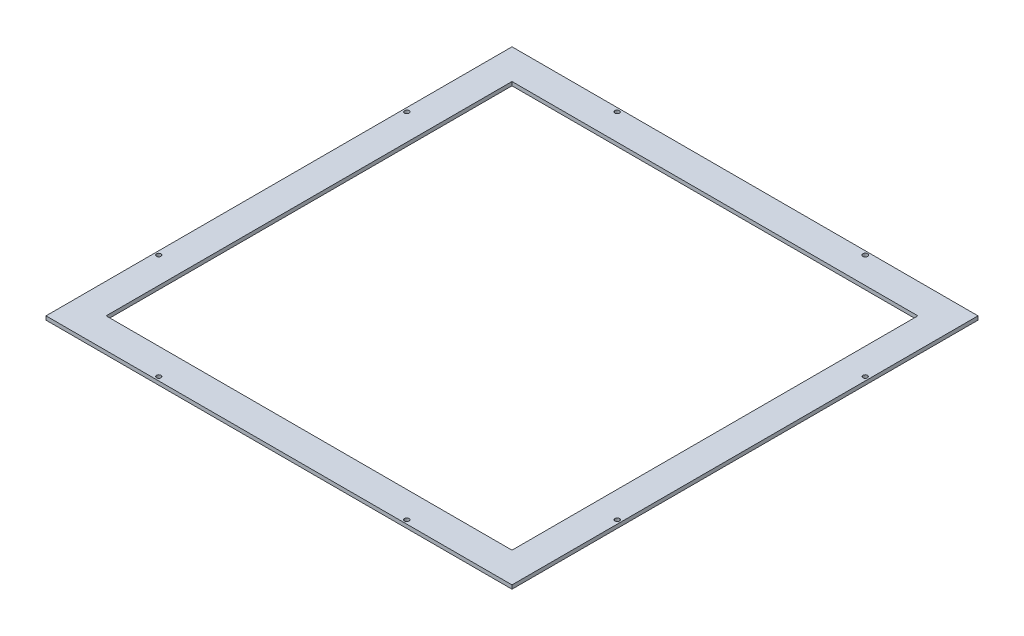
ISO-10303-21;
HEADER;
FILE_DESCRIPTION(('STEP AP214'),'2;1');
FILE_NAME('part.step','',(''),(''),'','','');
FILE_SCHEMA(('AUTOMOTIVE_DESIGN { 1 0 10303 214 1 1 1 1 }'));
ENDSEC;
DATA;
#1=APPLICATION_CONTEXT('core data for automotive mechanical design processes');
#2=APPLICATION_PROTOCOL_DEFINITION('international standard','automotive_design',2000,#1);
#3=PRODUCT_CONTEXT('',#1,'mechanical');
#4=PRODUCT('Part','Part','',(#3));
#5=PRODUCT_RELATED_PRODUCT_CATEGORY('part','',(#4));
#6=PRODUCT_DEFINITION_FORMATION('','',#4);
#7=PRODUCT_DEFINITION_CONTEXT('part definition',#1,'design');
#8=PRODUCT_DEFINITION('design','',#6,#7);
#9=PRODUCT_DEFINITION_SHAPE('','',#8);
#10=(LENGTH_UNIT() NAMED_UNIT(*) SI_UNIT(.MILLI.,.METRE.));
#11=(NAMED_UNIT(*) PLANE_ANGLE_UNIT() SI_UNIT($,.RADIAN.));
#12=(NAMED_UNIT(*) SI_UNIT($,.STERADIAN.) SOLID_ANGLE_UNIT());
#13=UNCERTAINTY_MEASURE_WITH_UNIT(LENGTH_MEASURE(1.E-05),#10,'distance_accuracy_value','');
#14=(GEOMETRIC_REPRESENTATION_CONTEXT(3) GLOBAL_UNCERTAINTY_ASSIGNED_CONTEXT((#13)) GLOBAL_UNIT_ASSIGNED_CONTEXT((#10,
#11,#12)) REPRESENTATION_CONTEXT('',''));
#15=CARTESIAN_POINT('',(0.,0.,0.));
#16=DIRECTION('',(0.,0.,1.));
#17=DIRECTION('',(1.,0.,0.));
#18=AXIS2_PLACEMENT_3D('',#15,#16,#17);
#19=CARTESIAN_POINT('',(-196.85,3.175,-196.85));
#20=DIRECTION('',(1.,0.,0.));
#21=DIRECTION('',(0.,0.,-1.));
#22=AXIS2_PLACEMENT_3D('',#19,#20,#21);
#23=PLANE('',#22);
#24=DIRECTION('',(0.,0.,1.));
#25=VECTOR('',#24,1.);
#26=CARTESIAN_POINT('',(-196.85,0.,-196.85));
#27=LINE('',#26,#25);
#28=CARTESIAN_POINT('',(-196.85,0.,-196.85));
#29=VERTEX_POINT('',#28);
#30=CARTESIAN_POINT('',(-196.85,0.,196.85));
#31=VERTEX_POINT('',#30);
#32=EDGE_CURVE('E134',#29,#31,#27,.T.);
#33=ORIENTED_EDGE('',*,*,#32,.T.);
#34=DIRECTION('',(0.,-1.,0.));
#35=VECTOR('',#34,1.);
#36=CARTESIAN_POINT('',(-196.85,3.175,196.85));
#37=LINE('',#36,#35);
#38=CARTESIAN_POINT('',(-196.85,3.175,196.85));
#39=VERTEX_POINT('',#38);
#40=EDGE_CURVE('E11',#39,#31,#37,.T.);
#41=ORIENTED_EDGE('',*,*,#40,.F.);
#42=DIRECTION('',(0.,0.,1.));
#43=VECTOR('',#42,1.);
#44=CARTESIAN_POINT('',(-196.85,3.175,-196.85));
#45=LINE('',#44,#43);
#46=CARTESIAN_POINT('',(-196.85,3.175,-196.85));
#47=VERTEX_POINT('',#46);
#48=EDGE_CURVE('E138',#47,#39,#45,.T.);
#49=ORIENTED_EDGE('',*,*,#48,.F.);
#50=DIRECTION('',(0.,-1.,0.));
#51=VECTOR('',#50,1.);
#52=CARTESIAN_POINT('',(-196.85,3.175,-196.85));
#53=LINE('',#52,#51);
#54=EDGE_CURVE('E148',#47,#29,#53,.T.);
#55=ORIENTED_EDGE('',*,*,#54,.T.);
#56=EDGE_LOOP('',(#33,#41,#49,#55));
#57=FACE_BOUND('',#56,.T.);
#58=ADVANCED_FACE('F33',(#57),#23,.F.);
#59=CARTESIAN_POINT('',(196.85,3.175,196.85));
#60=DIRECTION('',(0.,0.,-1.));
#61=DIRECTION('',(-1.,0.,0.));
#62=AXIS2_PLACEMENT_3D('',#59,#60,#61);
#63=PLANE('',#62);
#64=DIRECTION('',(1.,0.,0.));
#65=VECTOR('',#64,1.);
#66=CARTESIAN_POINT('',(196.85,0.,196.85));
#67=LINE('',#66,#65);
#68=CARTESIAN_POINT('',(196.85,0.,196.85));
#69=VERTEX_POINT('',#68);
#70=EDGE_CURVE('E151',#31,#69,#67,.T.);
#71=ORIENTED_EDGE('',*,*,#70,.T.);
#72=DIRECTION('',(0.,-1.,0.));
#73=VECTOR('',#72,1.);
#74=CARTESIAN_POINT('',(196.85,3.175,196.85));
#75=LINE('',#74,#73);
#76=CARTESIAN_POINT('',(196.85,3.175,196.85));
#77=VERTEX_POINT('',#76);
#78=EDGE_CURVE('E40',#77,#69,#75,.T.);
#79=ORIENTED_EDGE('',*,*,#78,.F.);
#80=DIRECTION('',(1.,0.,0.));
#81=VECTOR('',#80,1.);
#82=CARTESIAN_POINT('',(196.85,3.175,196.85));
#83=LINE('',#82,#81);
#84=EDGE_CURVE('E141',#39,#77,#83,.T.);
#85=ORIENTED_EDGE('',*,*,#84,.F.);
#86=ORIENTED_EDGE('',*,*,#40,.T.);
#87=EDGE_LOOP('',(#71,#79,#85,#86));
#88=FACE_BOUND('',#87,.T.);
#89=ADVANCED_FACE('F179',(#88),#63,.F.);
#90=CARTESIAN_POINT('',(196.85,3.175,-196.85));
#91=DIRECTION('',(-1.,0.,0.));
#92=DIRECTION('',(0.,0.,1.));
#93=AXIS2_PLACEMENT_3D('',#90,#91,#92);
#94=PLANE('',#93);
#95=DIRECTION('',(0.,0.,-1.));
#96=VECTOR('',#95,1.);
#97=CARTESIAN_POINT('',(196.85,0.,-196.85));
#98=LINE('',#97,#96);
#99=CARTESIAN_POINT('',(196.85,0.,-196.85));
#100=VERTEX_POINT('',#99);
#101=EDGE_CURVE('E153',#69,#100,#98,.T.);
#102=ORIENTED_EDGE('',*,*,#101,.T.);
#103=DIRECTION('',(0.,-1.,0.));
#104=VECTOR('',#103,1.);
#105=CARTESIAN_POINT('',(196.85,3.175,-196.85));
#106=LINE('',#105,#104);
#107=CARTESIAN_POINT('',(196.85,3.175,-196.85));
#108=VERTEX_POINT('',#107);
#109=EDGE_CURVE('E158',#108,#100,#106,.T.);
#110=ORIENTED_EDGE('',*,*,#109,.F.);
#111=DIRECTION('',(0.,0.,-1.));
#112=VECTOR('',#111,1.);
#113=CARTESIAN_POINT('',(196.85,3.175,-196.85));
#114=LINE('',#113,#112);
#115=EDGE_CURVE('E144',#77,#108,#114,.T.);
#116=ORIENTED_EDGE('',*,*,#115,.F.);
#117=ORIENTED_EDGE('',*,*,#78,.T.);
#118=EDGE_LOOP('',(#102,#110,#116,#117));
#119=FACE_BOUND('',#118,.T.);
#120=ADVANCED_FACE('F165',(#119),#94,.F.);
#121=CARTESIAN_POINT('',(196.85,3.175,-196.85));
#122=DIRECTION('',(0.,0.,1.));
#123=DIRECTION('',(1.,0.,0.));
#124=AXIS2_PLACEMENT_3D('',#121,#122,#123);
#125=PLANE('',#124);
#126=DIRECTION('',(-1.,0.,0.));
#127=VECTOR('',#126,1.);
#128=CARTESIAN_POINT('',(196.85,0.,-196.85));
#129=LINE('',#128,#127);
#130=EDGE_CURVE('E142',#100,#29,#129,.T.);
#131=ORIENTED_EDGE('',*,*,#130,.T.);
#132=ORIENTED_EDGE('',*,*,#54,.F.);
#133=DIRECTION('',(-1.,0.,0.));
#134=VECTOR('',#133,1.);
#135=CARTESIAN_POINT('',(196.85,3.175,-196.85));
#136=LINE('',#135,#134);
#137=EDGE_CURVE('E146',#108,#47,#136,.T.);
#138=ORIENTED_EDGE('',*,*,#137,.F.);
#139=ORIENTED_EDGE('',*,*,#109,.T.);
#140=EDGE_LOOP('',(#131,#132,#138,#139));
#141=FACE_BOUND('',#140,.T.);
#142=ADVANCED_FACE('F172',(#141),#125,.F.);
#143=CARTESIAN_POINT('',(0.,3.175,0.));
#144=DIRECTION('',(0.,-1.,0.));
#145=DIRECTION('',(0.,0.,-1.));
#146=AXIS2_PLACEMENT_3D('',#143,#144,#145);
#147=PLANE('',#146);
#148=CARTESIAN_POINT('',(104.775,3.175,193.675));
#149=DIRECTION('',(0.,1.,0.));
#150=DIRECTION('',(0.,0.,1.));
#151=AXIS2_PLACEMENT_3D('',#148,#149,#150);
#152=CIRCLE('',#151,1.905);
#153=CARTESIAN_POINT('',(104.775,3.175,195.58));
#154=VERTEX_POINT('',#153);
#155=EDGE_CURVE('E266',#154,#154,#152,.T.);
#156=ORIENTED_EDGE('',*,*,#155,.F.);
#157=EDGE_LOOP('',(#156));
#158=FACE_BOUND('',#157,.T.);
#159=CARTESIAN_POINT('',(-193.675,3.175,104.775));
#160=DIRECTION('',(0.,1.,0.));
#161=DIRECTION('',(0.,0.,1.));
#162=AXIS2_PLACEMENT_3D('',#159,#160,#161);
#163=CIRCLE('',#162,1.90499999999999);
#164=CARTESIAN_POINT('',(-193.675,3.175,106.68));
#165=VERTEX_POINT('',#164);
#166=EDGE_CURVE('E272',#165,#165,#163,.T.);
#167=ORIENTED_EDGE('',*,*,#166,.F.);
#168=EDGE_LOOP('',(#167));
#169=FACE_BOUND('',#168,.T.);
#170=CARTESIAN_POINT('',(-193.675,3.175,-104.775));
#171=DIRECTION('',(0.,1.,0.));
#172=DIRECTION('',(0.,0.,1.));
#173=AXIS2_PLACEMENT_3D('',#170,#171,#172);
#174=CIRCLE('',#173,1.90499999999999);
#175=CARTESIAN_POINT('',(-193.675,3.175,-102.87));
#176=VERTEX_POINT('',#175);
#177=EDGE_CURVE('E278',#176,#176,#174,.T.);
#178=ORIENTED_EDGE('',*,*,#177,.F.);
#179=EDGE_LOOP('',(#178));
#180=FACE_BOUND('',#179,.T.);
#181=CARTESIAN_POINT('',(-104.775,3.175,-193.675));
#182=DIRECTION('',(0.,1.,0.));
#183=DIRECTION('',(0.,0.,1.));
#184=AXIS2_PLACEMENT_3D('',#181,#182,#183);
#185=CIRCLE('',#184,1.905);
#186=CARTESIAN_POINT('',(-104.775,3.175,-191.77));
#187=VERTEX_POINT('',#186);
#188=EDGE_CURVE('E249',#187,#187,#185,.T.);
#189=ORIENTED_EDGE('',*,*,#188,.F.);
#190=EDGE_LOOP('',(#189));
#191=FACE_BOUND('',#190,.T.);
#192=CARTESIAN_POINT('',(104.775,3.175,-193.675));
#193=DIRECTION('',(0.,1.,0.));
#194=DIRECTION('',(0.,0.,1.));
#195=AXIS2_PLACEMENT_3D('',#192,#193,#194);
#196=CIRCLE('',#195,2.01965574961171);
#197=CARTESIAN_POINT('',(104.775,3.175,-191.655344250388));
#198=VERTEX_POINT('',#197);
#199=EDGE_CURVE('E245',#198,#198,#196,.T.);
#200=ORIENTED_EDGE('',*,*,#199,.F.);
#201=EDGE_LOOP('',(#200));
#202=FACE_BOUND('',#201,.T.);
#203=CARTESIAN_POINT('',(193.675,3.175,-104.775));
#204=DIRECTION('',(0.,1.,0.));
#205=DIRECTION('',(0.,0.,1.));
#206=AXIS2_PLACEMENT_3D('',#203,#204,#205);
#207=CIRCLE('',#206,1.90499999999999);
#208=CARTESIAN_POINT('',(193.675,3.175,-102.87));
#209=VERTEX_POINT('',#208);
#210=EDGE_CURVE('E252',#209,#209,#207,.T.);
#211=ORIENTED_EDGE('',*,*,#210,.F.);
#212=EDGE_LOOP('',(#211));
#213=FACE_BOUND('',#212,.T.);
#214=CARTESIAN_POINT('',(193.675,3.175,104.775));
#215=DIRECTION('',(0.,1.,0.));
#216=DIRECTION('',(0.,0.,1.));
#217=AXIS2_PLACEMENT_3D('',#214,#215,#216);
#218=CIRCLE('',#217,1.90499999999999);
#219=CARTESIAN_POINT('',(193.675,3.175,106.68));
#220=VERTEX_POINT('',#219);
#221=EDGE_CURVE('E260',#220,#220,#218,.T.);
#222=ORIENTED_EDGE('',*,*,#221,.F.);
#223=EDGE_LOOP('',(#222));
#224=FACE_BOUND('',#223,.T.);
#225=CARTESIAN_POINT('',(-104.775,3.175,193.675));
#226=DIRECTION('',(0.,1.,0.));
#227=DIRECTION('',(0.,0.,1.));
#228=AXIS2_PLACEMENT_3D('',#225,#226,#227);
#229=CIRCLE('',#228,1.905);
#230=CARTESIAN_POINT('',(-104.775,3.175,195.58));
#231=VERTEX_POINT('',#230);
#232=EDGE_CURVE('E121',#231,#231,#229,.T.);
#233=ORIENTED_EDGE('',*,*,#232,.F.);
#234=EDGE_LOOP('',(#233));
#235=FACE_BOUND('',#234,.T.);
#236=DIRECTION('',(1.,0.,0.));
#237=VECTOR('',#236,1.);
#238=CARTESIAN_POINT('',(171.45,3.175,171.45));
#239=LINE('',#238,#237);
#240=CARTESIAN_POINT('',(-171.45,3.175,171.45));
#241=VERTEX_POINT('',#240);
#242=CARTESIAN_POINT('',(171.45,3.175,171.45));
#243=VERTEX_POINT('',#242);
#244=EDGE_CURVE('E127',#241,#243,#239,.T.);
#245=ORIENTED_EDGE('',*,*,#244,.F.);
#246=DIRECTION('',(0.,0.,1.));
#247=VECTOR('',#246,1.);
#248=CARTESIAN_POINT('',(-171.45,3.175,-171.45));
#249=LINE('',#248,#247);
#250=CARTESIAN_POINT('',(-171.45,3.175,-171.45));
#251=VERTEX_POINT('',#250);
#252=EDGE_CURVE('E47',#251,#241,#249,.T.);
#253=ORIENTED_EDGE('',*,*,#252,.F.);
#254=DIRECTION('',(-1.,0.,0.));
#255=VECTOR('',#254,1.);
#256=CARTESIAN_POINT('',(171.45,3.175,-171.45));
#257=LINE('',#256,#255);
#258=CARTESIAN_POINT('',(171.45,3.175,-171.45));
#259=VERTEX_POINT('',#258);
#260=EDGE_CURVE('E115',#259,#251,#257,.T.);
#261=ORIENTED_EDGE('',*,*,#260,.F.);
#262=DIRECTION('',(0.,0.,-1.));
#263=VECTOR('',#262,1.);
#264=CARTESIAN_POINT('',(171.45,3.175,-171.45));
#265=LINE('',#264,#263);
#266=EDGE_CURVE('E118',#243,#259,#265,.T.);
#267=ORIENTED_EDGE('',*,*,#266,.F.);
#268=EDGE_LOOP('',(#245,#253,#261,#267));
#269=FACE_BOUND('',#268,.T.);
#270=ORIENTED_EDGE('',*,*,#48,.T.);
#271=ORIENTED_EDGE('',*,*,#84,.T.);
#272=ORIENTED_EDGE('',*,*,#115,.T.);
#273=ORIENTED_EDGE('',*,*,#137,.T.);
#274=EDGE_LOOP('',(#270,#271,#272,#273));
#275=FACE_BOUND('',#274,.T.);
#276=ADVANCED_FACE('F178',(#158,#169,#180,#191,#202,#213,#224,#235,#269,#275),#147,.F.);
#277=CARTESIAN_POINT('',(0.,0.,0.));
#278=DIRECTION('',(0.,-1.,0.));
#279=DIRECTION('',(0.,0.,-1.));
#280=AXIS2_PLACEMENT_3D('',#277,#278,#279);
#281=PLANE('',#280);
#282=CARTESIAN_POINT('',(104.775,0.,193.675));
#283=DIRECTION('',(0.,1.,0.));
#284=DIRECTION('',(0.,0.,1.));
#285=AXIS2_PLACEMENT_3D('',#282,#283,#284);
#286=CIRCLE('',#285,1.905);
#287=CARTESIAN_POINT('',(104.775,0.,195.58));
#288=VERTEX_POINT('',#287);
#289=EDGE_CURVE('E263',#288,#288,#286,.T.);
#290=ORIENTED_EDGE('',*,*,#289,.T.);
#291=EDGE_LOOP('',(#290));
#292=FACE_BOUND('',#291,.T.);
#293=CARTESIAN_POINT('',(-193.675,0.,104.775));
#294=DIRECTION('',(0.,1.,0.));
#295=DIRECTION('',(0.,0.,1.));
#296=AXIS2_PLACEMENT_3D('',#293,#294,#295);
#297=CIRCLE('',#296,1.90499999999999);
#298=CARTESIAN_POINT('',(-193.675,0.,106.68));
#299=VERTEX_POINT('',#298);
#300=EDGE_CURVE('E269',#299,#299,#297,.T.);
#301=ORIENTED_EDGE('',*,*,#300,.T.);
#302=EDGE_LOOP('',(#301));
#303=FACE_BOUND('',#302,.T.);
#304=CARTESIAN_POINT('',(-193.675,0.,-104.775));
#305=DIRECTION('',(0.,1.,0.));
#306=DIRECTION('',(0.,0.,1.));
#307=AXIS2_PLACEMENT_3D('',#304,#305,#306);
#308=CIRCLE('',#307,1.90499999999999);
#309=CARTESIAN_POINT('',(-193.675,0.,-102.87));
#310=VERTEX_POINT('',#309);
#311=EDGE_CURVE('E275',#310,#310,#308,.T.);
#312=ORIENTED_EDGE('',*,*,#311,.T.);
#313=EDGE_LOOP('',(#312));
#314=FACE_BOUND('',#313,.T.);
#315=CARTESIAN_POINT('',(-104.775,0.,-193.675));
#316=DIRECTION('',(0.,1.,0.));
#317=DIRECTION('',(0.,0.,1.));
#318=AXIS2_PLACEMENT_3D('',#315,#316,#317);
#319=CIRCLE('',#318,1.905);
#320=CARTESIAN_POINT('',(-104.775,0.,-191.77));
#321=VERTEX_POINT('',#320);
#322=EDGE_CURVE('E281',#321,#321,#319,.T.);
#323=ORIENTED_EDGE('',*,*,#322,.T.);
#324=EDGE_LOOP('',(#323));
#325=FACE_BOUND('',#324,.T.);
#326=CARTESIAN_POINT('',(104.775,0.,-193.675));
#327=DIRECTION('',(0.,1.,0.));
#328=DIRECTION('',(0.,0.,1.));
#329=AXIS2_PLACEMENT_3D('',#326,#327,#328);
#330=CIRCLE('',#329,2.01965574961171);
#331=CARTESIAN_POINT('',(104.775,0.,-191.655344250388));
#332=VERTEX_POINT('',#331);
#333=EDGE_CURVE('E242',#332,#332,#330,.T.);
#334=ORIENTED_EDGE('',*,*,#333,.T.);
#335=EDGE_LOOP('',(#334));
#336=FACE_BOUND('',#335,.T.);
#337=CARTESIAN_POINT('',(193.675,0.,-104.775));
#338=DIRECTION('',(0.,1.,0.));
#339=DIRECTION('',(0.,0.,1.));
#340=AXIS2_PLACEMENT_3D('',#337,#338,#339);
#341=CIRCLE('',#340,1.90499999999999);
#342=CARTESIAN_POINT('',(193.675,0.,-102.87));
#343=VERTEX_POINT('',#342);
#344=EDGE_CURVE('E247',#343,#343,#341,.T.);
#345=ORIENTED_EDGE('',*,*,#344,.T.);
#346=EDGE_LOOP('',(#345));
#347=FACE_BOUND('',#346,.T.);
#348=CARTESIAN_POINT('',(193.675,0.,104.775));
#349=DIRECTION('',(0.,1.,0.));
#350=DIRECTION('',(0.,0.,1.));
#351=AXIS2_PLACEMENT_3D('',#348,#349,#350);
#352=CIRCLE('',#351,1.90499999999999);
#353=CARTESIAN_POINT('',(193.675,0.,106.68));
#354=VERTEX_POINT('',#353);
#355=EDGE_CURVE('E257',#354,#354,#352,.T.);
#356=ORIENTED_EDGE('',*,*,#355,.T.);
#357=EDGE_LOOP('',(#356));
#358=FACE_BOUND('',#357,.T.);
#359=CARTESIAN_POINT('',(-104.775,0.,193.675));
#360=DIRECTION('',(0.,1.,0.));
#361=DIRECTION('',(0.,0.,1.));
#362=AXIS2_PLACEMENT_3D('',#359,#360,#361);
#363=CIRCLE('',#362,1.905);
#364=CARTESIAN_POINT('',(-104.775,0.,195.58));
#365=VERTEX_POINT('',#364);
#366=EDGE_CURVE('E128',#365,#365,#363,.T.);
#367=ORIENTED_EDGE('',*,*,#366,.T.);
#368=EDGE_LOOP('',(#367));
#369=FACE_BOUND('',#368,.T.);
#370=DIRECTION('',(0.,0.,1.));
#371=VECTOR('',#370,1.);
#372=CARTESIAN_POINT('',(-171.45,0.,-171.45));
#373=LINE('',#372,#371);
#374=CARTESIAN_POINT('',(-171.45,0.,-171.45));
#375=VERTEX_POINT('',#374);
#376=CARTESIAN_POINT('',(-171.45,0.,171.45));
#377=VERTEX_POINT('',#376);
#378=EDGE_CURVE('E99',#375,#377,#373,.T.);
#379=ORIENTED_EDGE('',*,*,#378,.T.);
#380=DIRECTION('',(1.,0.,0.));
#381=VECTOR('',#380,1.);
#382=CARTESIAN_POINT('',(171.45,0.,171.45));
#383=LINE('',#382,#381);
#384=CARTESIAN_POINT('',(171.45,0.,171.45));
#385=VERTEX_POINT('',#384);
#386=EDGE_CURVE('E108',#377,#385,#383,.T.);
#387=ORIENTED_EDGE('',*,*,#386,.T.);
#388=DIRECTION('',(0.,0.,-1.));
#389=VECTOR('',#388,1.);
#390=CARTESIAN_POINT('',(171.45,0.,-171.45));
#391=LINE('',#390,#389);
#392=CARTESIAN_POINT('',(171.45,0.,-171.45));
#393=VERTEX_POINT('',#392);
#394=EDGE_CURVE('E55',#385,#393,#391,.T.);
#395=ORIENTED_EDGE('',*,*,#394,.T.);
#396=DIRECTION('',(-1.,0.,0.));
#397=VECTOR('',#396,1.);
#398=CARTESIAN_POINT('',(171.45,0.,-171.45));
#399=LINE('',#398,#397);
#400=EDGE_CURVE('E105',#393,#375,#399,.T.);
#401=ORIENTED_EDGE('',*,*,#400,.T.);
#402=EDGE_LOOP('',(#379,#387,#395,#401));
#403=FACE_BOUND('',#402,.T.);
#404=ORIENTED_EDGE('',*,*,#32,.F.);
#405=ORIENTED_EDGE('',*,*,#130,.F.);
#406=ORIENTED_EDGE('',*,*,#101,.F.);
#407=ORIENTED_EDGE('',*,*,#70,.F.);
#408=EDGE_LOOP('',(#404,#405,#406,#407));
#409=FACE_BOUND('',#408,.T.);
#410=ADVANCED_FACE('F112',(#292,#303,#314,#325,#336,#347,#358,#369,#403,#409),#281,.T.);
#411=CARTESIAN_POINT('',(-171.45,0.,-171.45));
#412=DIRECTION('',(-1.,0.,0.));
#413=DIRECTION('',(0.,0.,1.));
#414=AXIS2_PLACEMENT_3D('',#411,#412,#413);
#415=PLANE('',#414);
#416=ORIENTED_EDGE('',*,*,#252,.T.);
#417=DIRECTION('',(0.,1.,0.));
#418=VECTOR('',#417,1.);
#419=CARTESIAN_POINT('',(-171.45,0.,171.45));
#420=LINE('',#419,#418);
#421=EDGE_CURVE('E95',#377,#241,#420,.T.);
#422=ORIENTED_EDGE('',*,*,#421,.F.);
#423=ORIENTED_EDGE('',*,*,#378,.F.);
#424=DIRECTION('',(0.,1.,0.));
#425=VECTOR('',#424,1.);
#426=CARTESIAN_POINT('',(-171.45,0.,-171.45));
#427=LINE('',#426,#425);
#428=EDGE_CURVE('E132',#375,#251,#427,.T.);
#429=ORIENTED_EDGE('',*,*,#428,.T.);
#430=EDGE_LOOP('',(#416,#422,#423,#429));
#431=FACE_BOUND('',#430,.T.);
#432=ADVANCED_FACE('F97',(#431),#415,.F.);
#433=CARTESIAN_POINT('',(171.45,0.,-171.45));
#434=DIRECTION('',(0.,0.,-1.));
#435=DIRECTION('',(-1.,0.,0.));
#436=AXIS2_PLACEMENT_3D('',#433,#434,#435);
#437=PLANE('',#436);
#438=ORIENTED_EDGE('',*,*,#260,.T.);
#439=ORIENTED_EDGE('',*,*,#428,.F.);
#440=ORIENTED_EDGE('',*,*,#400,.F.);
#441=DIRECTION('',(0.,1.,0.));
#442=VECTOR('',#441,1.);
#443=CARTESIAN_POINT('',(171.45,0.,-171.45));
#444=LINE('',#443,#442);
#445=EDGE_CURVE('E135',#393,#259,#444,.T.);
#446=ORIENTED_EDGE('',*,*,#445,.T.);
#447=EDGE_LOOP('',(#438,#439,#440,#446));
#448=FACE_BOUND('',#447,.T.);
#449=ADVANCED_FACE('F197',(#448),#437,.F.);
#450=CARTESIAN_POINT('',(171.45,0.,-171.45));
#451=DIRECTION('',(1.,0.,0.));
#452=DIRECTION('',(0.,0.,-1.));
#453=AXIS2_PLACEMENT_3D('',#450,#451,#452);
#454=PLANE('',#453);
#455=ORIENTED_EDGE('',*,*,#266,.T.);
#456=ORIENTED_EDGE('',*,*,#445,.F.);
#457=ORIENTED_EDGE('',*,*,#394,.F.);
#458=DIRECTION('',(0.,1.,0.));
#459=VECTOR('',#458,1.);
#460=CARTESIAN_POINT('',(171.45,0.,171.45));
#461=LINE('',#460,#459);
#462=EDGE_CURVE('E104',#385,#243,#461,.T.);
#463=ORIENTED_EDGE('',*,*,#462,.T.);
#464=EDGE_LOOP('',(#455,#456,#457,#463));
#465=FACE_BOUND('',#464,.T.);
#466=ADVANCED_FACE('F201',(#465),#454,.F.);
#467=CARTESIAN_POINT('',(171.45,0.,171.45));
#468=DIRECTION('',(0.,0.,1.));
#469=DIRECTION('',(1.,0.,0.));
#470=AXIS2_PLACEMENT_3D('',#467,#468,#469);
#471=PLANE('',#470);
#472=ORIENTED_EDGE('',*,*,#244,.T.);
#473=ORIENTED_EDGE('',*,*,#462,.F.);
#474=ORIENTED_EDGE('',*,*,#386,.F.);
#475=ORIENTED_EDGE('',*,*,#421,.T.);
#476=EDGE_LOOP('',(#472,#473,#474,#475));
#477=FACE_BOUND('',#476,.T.);
#478=ADVANCED_FACE('F109',(#477),#471,.F.);
#479=CARTESIAN_POINT('',(-104.775,0.,193.675));
#480=DIRECTION('',(0.,1.,0.));
#481=DIRECTION('',(0.,0.,1.));
#482=AXIS2_PLACEMENT_3D('',#479,#480,#481);
#483=CYLINDRICAL_SURFACE('',#482,1.905);
#484=ORIENTED_EDGE('',*,*,#366,.F.);
#485=EDGE_LOOP('',(#484));
#486=FACE_BOUND('',#485,.T.);
#487=ORIENTED_EDGE('',*,*,#232,.T.);
#488=EDGE_LOOP('',(#487));
#489=FACE_BOUND('',#488,.T.);
#490=ADVANCED_FACE('F200',(#486,#489),#483,.F.);
#491=CARTESIAN_POINT('',(193.675,0.,104.775));
#492=DIRECTION('',(0.,1.,0.));
#493=DIRECTION('',(0.,0.,1.));
#494=AXIS2_PLACEMENT_3D('',#491,#492,#493);
#495=CYLINDRICAL_SURFACE('',#494,1.90499999999999);
#496=ORIENTED_EDGE('',*,*,#355,.F.);
#497=EDGE_LOOP('',(#496));
#498=FACE_BOUND('',#497,.T.);
#499=ORIENTED_EDGE('',*,*,#221,.T.);
#500=EDGE_LOOP('',(#499));
#501=FACE_BOUND('',#500,.T.);
#502=ADVANCED_FACE('F209',(#498,#501),#495,.F.);
#503=CARTESIAN_POINT('',(193.675,0.,-104.775));
#504=DIRECTION('',(0.,1.,0.));
#505=DIRECTION('',(0.,0.,1.));
#506=AXIS2_PLACEMENT_3D('',#503,#504,#505);
#507=CYLINDRICAL_SURFACE('',#506,1.90499999999999);
#508=ORIENTED_EDGE('',*,*,#344,.F.);
#509=EDGE_LOOP('',(#508));
#510=FACE_BOUND('',#509,.T.);
#511=ORIENTED_EDGE('',*,*,#210,.T.);
#512=EDGE_LOOP('',(#511));
#513=FACE_BOUND('',#512,.T.);
#514=ADVANCED_FACE('F230',(#510,#513),#507,.F.);
#515=CARTESIAN_POINT('',(104.775,0.,-193.675));
#516=DIRECTION('',(0.,1.,0.));
#517=DIRECTION('',(0.,0.,1.));
#518=AXIS2_PLACEMENT_3D('',#515,#516,#517);
#519=CYLINDRICAL_SURFACE('',#518,2.01965574961171);
#520=ORIENTED_EDGE('',*,*,#333,.F.);
#521=EDGE_LOOP('',(#520));
#522=FACE_BOUND('',#521,.T.);
#523=ORIENTED_EDGE('',*,*,#199,.T.);
#524=EDGE_LOOP('',(#523));
#525=FACE_BOUND('',#524,.T.);
#526=ADVANCED_FACE('F215',(#522,#525),#519,.F.);
#527=CARTESIAN_POINT('',(-104.775,0.,-193.675));
#528=DIRECTION('',(0.,1.,0.));
#529=DIRECTION('',(0.,0.,1.));
#530=AXIS2_PLACEMENT_3D('',#527,#528,#529);
#531=CYLINDRICAL_SURFACE('',#530,1.905);
#532=ORIENTED_EDGE('',*,*,#322,.F.);
#533=EDGE_LOOP('',(#532));
#534=FACE_BOUND('',#533,.T.);
#535=ORIENTED_EDGE('',*,*,#188,.T.);
#536=EDGE_LOOP('',(#535));
#537=FACE_BOUND('',#536,.T.);
#538=ADVANCED_FACE('F211',(#534,#537),#531,.F.);
#539=CARTESIAN_POINT('',(-193.675,0.,-104.775));
#540=DIRECTION('',(0.,1.,0.));
#541=DIRECTION('',(0.,0.,1.));
#542=AXIS2_PLACEMENT_3D('',#539,#540,#541);
#543=CYLINDRICAL_SURFACE('',#542,1.90499999999999);
#544=ORIENTED_EDGE('',*,*,#311,.F.);
#545=EDGE_LOOP('',(#544));
#546=FACE_BOUND('',#545,.T.);
#547=ORIENTED_EDGE('',*,*,#177,.T.);
#548=EDGE_LOOP('',(#547));
#549=FACE_BOUND('',#548,.T.);
#550=ADVANCED_FACE('F214',(#546,#549),#543,.F.);
#551=CARTESIAN_POINT('',(-193.675,0.,104.775));
#552=DIRECTION('',(0.,1.,0.));
#553=DIRECTION('',(0.,0.,1.));
#554=AXIS2_PLACEMENT_3D('',#551,#552,#553);
#555=CYLINDRICAL_SURFACE('',#554,1.90499999999999);
#556=ORIENTED_EDGE('',*,*,#300,.F.);
#557=EDGE_LOOP('',(#556));
#558=FACE_BOUND('',#557,.T.);
#559=ORIENTED_EDGE('',*,*,#166,.T.);
#560=EDGE_LOOP('',(#559));
#561=FACE_BOUND('',#560,.T.);
#562=ADVANCED_FACE('F219',(#558,#561),#555,.F.);
#563=CARTESIAN_POINT('',(104.775,0.,193.675));
#564=DIRECTION('',(0.,1.,0.));
#565=DIRECTION('',(0.,0.,1.));
#566=AXIS2_PLACEMENT_3D('',#563,#564,#565);
#567=CYLINDRICAL_SURFACE('',#566,1.905);
#568=ORIENTED_EDGE('',*,*,#289,.F.);
#569=EDGE_LOOP('',(#568));
#570=FACE_BOUND('',#569,.T.);
#571=ORIENTED_EDGE('',*,*,#155,.T.);
#572=EDGE_LOOP('',(#571));
#573=FACE_BOUND('',#572,.T.);
#574=ADVANCED_FACE('F223',(#570,#573),#567,.F.);
#575=CLOSED_SHELL('',(#58,#89,#120,#142,#276,#410,#432,#449,#466,#478,#490,#502,#514,#526,#538,
#550,#562,#574));
#576=MANIFOLD_SOLID_BREP('B2',#575);
#577=ADVANCED_BREP_SHAPE_REPRESENTATION('',(#18,#576),#14);
#578=SHAPE_DEFINITION_REPRESENTATION(#9,#577);
ENDSEC;
END-ISO-10303-21;
